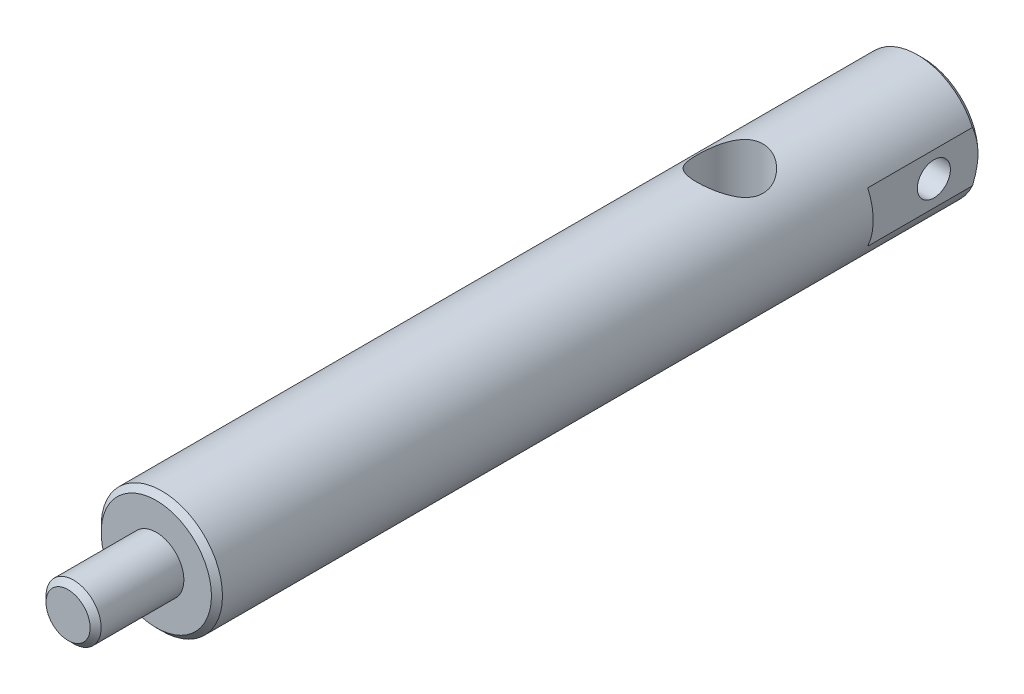
ISO-10303-21;
HEADER;
FILE_DESCRIPTION(('STEP AP214'),'2;1');
FILE_NAME('part.step','',(''),(''),'','','');
FILE_SCHEMA(('AUTOMOTIVE_DESIGN { 1 0 10303 214 1 1 1 1 }'));
ENDSEC;
DATA;
#1=APPLICATION_CONTEXT('core data for automotive mechanical design processes');
#2=APPLICATION_PROTOCOL_DEFINITION('international standard','automotive_design',2000,#1);
#3=PRODUCT_CONTEXT('',#1,'mechanical');
#4=PRODUCT('Part','Part','',(#3));
#5=PRODUCT_RELATED_PRODUCT_CATEGORY('part','',(#4));
#6=PRODUCT_DEFINITION_FORMATION('','',#4);
#7=PRODUCT_DEFINITION_CONTEXT('part definition',#1,'design');
#8=PRODUCT_DEFINITION('design','',#6,#7);
#9=PRODUCT_DEFINITION_SHAPE('','',#8);
#10=(LENGTH_UNIT() NAMED_UNIT(*) SI_UNIT(.MILLI.,.METRE.));
#11=(NAMED_UNIT(*) PLANE_ANGLE_UNIT() SI_UNIT($,.RADIAN.));
#12=(NAMED_UNIT(*) SI_UNIT($,.STERADIAN.) SOLID_ANGLE_UNIT());
#13=UNCERTAINTY_MEASURE_WITH_UNIT(LENGTH_MEASURE(1.E-05),#10,'distance_accuracy_value','');
#14=(GEOMETRIC_REPRESENTATION_CONTEXT(3) GLOBAL_UNCERTAINTY_ASSIGNED_CONTEXT((#13)) GLOBAL_UNIT_ASSIGNED_CONTEXT((#10,
#11,#12)) REPRESENTATION_CONTEXT('',''));
#15=CARTESIAN_POINT('',(0.,0.,0.));
#16=DIRECTION('',(0.,0.,1.));
#17=DIRECTION('',(1.,0.,0.));
#18=AXIS2_PLACEMENT_3D('',#15,#16,#17);
#19=CARTESIAN_POINT('',(0.,0.,0.500000000000014));
#20=DIRECTION('',(0.,0.,1.));
#21=DIRECTION('',(1.,0.,0.));
#22=AXIS2_PLACEMENT_3D('',#19,#20,#21);
#23=CONICAL_SURFACE('',#22,5.5,0.785398163397443);
#24=CARTESIAN_POINT('',(-5.,-3.59605027477681,1.15886171128421));
#25=CARTESIAN_POINT('',(-5.,-3.5057054306609,1.10611666521081));
#26=CARTESIAN_POINT('',(-5.,-3.41479612769908,1.05434027979705));
#27=CARTESIAN_POINT('',(-5.,-3.23172350305265,0.953000108204818));
#28=CARTESIAN_POINT('',(-5.,-3.13955986612799,0.903436892158479));
#29=CARTESIAN_POINT('',(-5.,-2.86034805305465,0.758144595115378));
#30=CARTESIAN_POINT('',(-5.,-2.67127970378338,0.66622747635825));
#31=CARTESIAN_POINT('',(-5.,-2.28407584772363,0.494217891562359));
#32=CARTESIAN_POINT('',(-5.,-2.08584276940193,0.414342642103693));
#33=CARTESIAN_POINT('',(-5.,-1.68330442783959,0.272400086167916));
#34=CARTESIAN_POINT('',(-5.,-1.47901002692424,0.210302823558386));
#35=CARTESIAN_POINT('',(-5.,-1.14754801322566,0.128576798986462));
#36=CARTESIAN_POINT('',(-5.,-1.02210995808063,0.101887344642865));
#37=CARTESIAN_POINT('',(-5.,-0.769641255775877,0.0573632386148024));
#38=CARTESIAN_POINT('',(-5.,-0.642610531730337,0.0395290161157409));
#39=CARTESIAN_POINT('',(-5.,-0.388638018822018,0.0135039770324979));
#40=CARTESIAN_POINT('',(-5.,-0.261704508346706,0.00523313080455806));
#41=CARTESIAN_POINT('',(-5.,-0.0075734961203176,-0.00160825561372747));
#42=CARTESIAN_POINT('',(-5.,0.119624011549556,-0.000178575918303746));
#43=CARTESIAN_POINT('',(-5.,0.393277408420786,0.0133041793929394));
#44=CARTESIAN_POINT('',(-5.,0.539655207095598,0.0269731682855102));
#45=CARTESIAN_POINT('',(-5.,0.830756491663134,0.0664914605878033));
#46=CARTESIAN_POINT('',(-5.,0.975479638048458,0.092343219339984));
#47=CARTESIAN_POINT('',(-5.,1.26429120607209,0.155416051958378));
#48=CARTESIAN_POINT('',(-5.,1.40834917898135,0.192774954808121));
#49=CARTESIAN_POINT('',(-5.,1.69350482897433,0.27725361613581));
#50=CARTESIAN_POINT('',(-5.,1.83460309803712,0.324371401809384));
#51=CARTESIAN_POINT('',(-5.,2.15286476123639,0.441248293288971));
#52=CARTESIAN_POINT('',(-5.,2.32905225093761,0.51365188230633));
#53=CARTESIAN_POINT('',(-5.,2.67664432359225,0.669236750507722));
#54=CARTESIAN_POINT('',(-5.,2.84804630257685,0.752423763590871));
#55=CARTESIAN_POINT('',(-5.,3.18703727799204,0.927569112430905));
#56=CARTESIAN_POINT('',(-5.,3.35461076438016,1.01955723478527));
#57=CARTESIAN_POINT('',(-5.,3.68583270101324,1.21023606625668));
#58=CARTESIAN_POINT('',(-5.,3.84948185902625,1.30892555426514));
#59=CARTESIAN_POINT('',(-5.,4.1658857680653,1.50692724123942));
#60=CARTESIAN_POINT('',(-5.,4.31879313955326,1.60599682317832));
#61=CARTESIAN_POINT('',(-5.,4.62198652599246,1.8080831313131));
#62=CARTESIAN_POINT('',(-5.,4.77227232695427,1.91110017755267));
#63=CARTESIAN_POINT('',(-5.,5.06930043880817,2.11945768935238));
#64=CARTESIAN_POINT('',(-5.,5.2160620729335,2.22477070562688));
#65=CARTESIAN_POINT('',(-5.,5.50761291243092,2.43801228770006));
#66=CARTESIAN_POINT('',(-5.,5.65240264981636,2.54594012527707));
#67=CARTESIAN_POINT('',(-5.,5.79637433820874,2.65493014133019));
#68=B_SPLINE_CURVE_WITH_KNOTS('',3,(#24,#25,#26,#27,#28,#29,#30,#31,#32,#33,#34,#35,#36,#37,#38,
#39,#40,#41,#42,#43,#44,#45,#46,#47,#48,#49,#50,#51,#52,#53,#54,#55,#56,#57,#58,#59,#60,#61,#62,
#63,#64,#65,#66,#67),.UNSPECIFIED.,.F.,.F.,(4,2,2,2,2,2,2,2,2,2,2,2,2,2,2,2,2,2,2,2,2,4),(0.,
0.313832173275975,0.627744731530514,1.25800962201332,1.89855009594016,2.53800481166332,
2.92247147827315,3.30695677696199,3.68820073621962,4.06945333731811,4.50993622933902,
4.9505079352507,5.39657659374408,5.8425551652068,6.41353259125284,6.98481487969802,
7.55810405253176,8.13128904071377,8.6778051629313,9.22436568850415,9.7662459996794,
10.3079770948805),.UNSPECIFIED.);
#69=CARTESIAN_POINT('',(-5.,2.29128784747841,0.499999999999884));
#70=VERTEX_POINT('',#69);
#71=CARTESIAN_POINT('',(-5.,0.,0.));
#72=VERTEX_POINT('',#71);
#73=EDGE_CURVE('E51',#70,#72,#68,.F.);
#74=ORIENTED_EDGE('',*,*,#73,.F.);
#75=CARTESIAN_POINT('',(0.,0.,0.500000000000014));
#76=DIRECTION('',(0.,0.,1.));
#77=DIRECTION('',(1.,0.,0.));
#78=AXIS2_PLACEMENT_3D('',#75,#76,#77);
#79=CIRCLE('',#78,5.5);
#80=CARTESIAN_POINT('',(5.,2.29128784747841,0.499999999999884));
#81=VERTEX_POINT('',#80);
#82=EDGE_CURVE('E97',#81,#70,#79,.T.);
#83=ORIENTED_EDGE('',*,*,#82,.F.);
#84=CARTESIAN_POINT('',(5.,-3.59605027477681,1.15886171128421));
#85=CARTESIAN_POINT('',(5.,-3.5057054306609,1.10611666521081));
#86=CARTESIAN_POINT('',(5.,-3.41479612769908,1.05434027979705));
#87=CARTESIAN_POINT('',(5.,-3.23172350305265,0.953000108204818));
#88=CARTESIAN_POINT('',(5.,-3.13955986612799,0.903436892158479));
#89=CARTESIAN_POINT('',(5.,-2.86034805305465,0.758144595115378));
#90=CARTESIAN_POINT('',(5.,-2.67127970378338,0.66622747635825));
#91=CARTESIAN_POINT('',(5.,-2.28407584772363,0.494217891562359));
#92=CARTESIAN_POINT('',(5.,-2.08584276940193,0.414342642103693));
#93=CARTESIAN_POINT('',(5.,-1.68330442783959,0.272400086167916));
#94=CARTESIAN_POINT('',(5.,-1.47901002692424,0.210302823558386));
#95=CARTESIAN_POINT('',(5.,-1.14754801322566,0.128576798986462));
#96=CARTESIAN_POINT('',(5.,-1.02210995808063,0.101887344642865));
#97=CARTESIAN_POINT('',(5.,-0.769641255775877,0.0573632386148024));
#98=CARTESIAN_POINT('',(5.,-0.642610531730337,0.0395290161157409));
#99=CARTESIAN_POINT('',(5.,-0.388638018822018,0.0135039770324979));
#100=CARTESIAN_POINT('',(5.,-0.261704508346706,0.00523313080455806));
#101=CARTESIAN_POINT('',(5.,-0.0075734961203176,-0.00160825561372747));
#102=CARTESIAN_POINT('',(5.,0.119624011549556,-0.000178575918303746));
#103=CARTESIAN_POINT('',(5.,0.393277408420786,0.0133041793929394));
#104=CARTESIAN_POINT('',(5.,0.539655207095598,0.0269731682855102));
#105=CARTESIAN_POINT('',(5.,0.830756491663134,0.0664914605878033));
#106=CARTESIAN_POINT('',(5.,0.975479638048458,0.092343219339984));
#107=CARTESIAN_POINT('',(5.,1.26429120607209,0.155416051958378));
#108=CARTESIAN_POINT('',(5.,1.40834917898135,0.192774954808121));
#109=CARTESIAN_POINT('',(5.,1.69350482897433,0.27725361613581));
#110=CARTESIAN_POINT('',(5.,1.83460309803712,0.324371401809384));
#111=CARTESIAN_POINT('',(5.,2.15286476123639,0.441248293288971));
#112=CARTESIAN_POINT('',(5.,2.32905225093761,0.51365188230633));
#113=CARTESIAN_POINT('',(5.,2.67664432359225,0.669236750507722));
#114=CARTESIAN_POINT('',(5.,2.84804630257685,0.752423763590871));
#115=CARTESIAN_POINT('',(5.,3.18703727799204,0.927569112430905));
#116=CARTESIAN_POINT('',(5.,3.35461076438016,1.01955723478527));
#117=CARTESIAN_POINT('',(5.,3.68583270101324,1.21023606625668));
#118=CARTESIAN_POINT('',(5.,3.84948185902625,1.30892555426514));
#119=CARTESIAN_POINT('',(5.,4.1658857680653,1.50692724123942));
#120=CARTESIAN_POINT('',(5.,4.31879313955326,1.60599682317832));
#121=CARTESIAN_POINT('',(5.,4.62198652599246,1.8080831313131));
#122=CARTESIAN_POINT('',(5.,4.77227232695427,1.91110017755267));
#123=CARTESIAN_POINT('',(5.,5.06930043880817,2.11945768935238));
#124=CARTESIAN_POINT('',(5.,5.2160620729335,2.22477070562688));
#125=CARTESIAN_POINT('',(5.,5.50761291243092,2.43801228770006));
#126=CARTESIAN_POINT('',(5.,5.65240264981636,2.54594012527707));
#127=CARTESIAN_POINT('',(5.,5.79637433820874,2.65493014133019));
#128=B_SPLINE_CURVE_WITH_KNOTS('',3,(#84,#85,#86,#87,#88,#89,#90,#91,#92,#93,#94,#95,#96,#97,
#98,#99,#100,#101,#102,#103,#104,#105,#106,#107,#108,#109,#110,#111,#112,#113,#114,#115,#116,
#117,#118,#119,#120,#121,#122,#123,#124,#125,#126,#127),.UNSPECIFIED.,.F.,.F.,(4,2,2,2,2,2,2,2,
2,2,2,2,2,2,2,2,2,2,2,2,2,4),(0.,0.313832173275975,0.627744731530514,1.25800962201332,
1.89855009594016,2.53800481166332,2.92247147827315,3.30695677696199,3.68820073621962,
4.06945333731811,4.50993622933902,4.9505079352507,5.39657659374408,5.8425551652068,
6.41353259125284,6.98481487969802,7.55810405253176,8.13128904071377,8.6778051629313,
9.22436568850415,9.7662459996794,10.3079770948805),.UNSPECIFIED.);
#129=CARTESIAN_POINT('',(5.,0.,0.));
#130=VERTEX_POINT('',#129);
#131=EDGE_CURVE('E122',#81,#130,#128,.F.);
#132=ORIENTED_EDGE('',*,*,#131,.T.);
#133=CARTESIAN_POINT('',(0.,0.,0.));
#134=DIRECTION('',(0.,0.,1.));
#135=DIRECTION('',(1.,0.,0.));
#136=AXIS2_PLACEMENT_3D('',#133,#134,#135);
#137=CIRCLE('',#136,4.99999999999999);
#138=EDGE_CURVE('E162',#72,#130,#137,.F.);
#139=ORIENTED_EDGE('',*,*,#138,.F.);
#140=EDGE_LOOP('',(#74,#83,#132,#139));
#141=FACE_BOUND('',#140,.T.);
#142=ADVANCED_FACE('F36',(#141),#23,.T.);
#143=CARTESIAN_POINT('',(0.,0.,69.5));
#144=DIRECTION('',(0.,0.,-1.));
#145=DIRECTION('',(-1.,0.,0.));
#146=AXIS2_PLACEMENT_3D('',#143,#144,#145);
#147=CYLINDRICAL_SURFACE('',#146,5.5);
#148=CARTESIAN_POINT('',(0.,0.,69.));
#149=DIRECTION('',(0.,0.,1.));
#150=DIRECTION('',(1.,0.,0.));
#151=AXIS2_PLACEMENT_3D('',#148,#149,#150);
#152=CIRCLE('',#151,5.5);
#153=CARTESIAN_POINT('',(5.5,0.,69.));
#154=VERTEX_POINT('',#153);
#155=EDGE_CURVE('E215',#154,#154,#152,.F.);
#156=ORIENTED_EDGE('',*,*,#155,.T.);
#157=EDGE_LOOP('',(#156));
#158=FACE_BOUND('',#157,.T.);
#159=CARTESIAN_POINT('',(0.,5.5,20.5));
#160=CARTESIAN_POINT('',(-0.155941063421442,5.49998934645942,20.4999877662548));
#161=CARTESIAN_POINT('',(-0.312022244637955,5.49329922861326,20.4877694125018));
#162=CARTESIAN_POINT('',(-0.619456123460682,5.46719110321039,20.4394852853526));
#163=CARTESIAN_POINT('',(-0.770801809879889,5.44775507973285,20.4033857560615));
#164=CARTESIAN_POINT('',(-1.06387890229515,5.39816336864634,20.3092272238748));
#165=CARTESIAN_POINT('',(-1.2056469629153,5.36805167294482,20.2512582777309));
#166=CARTESIAN_POINT('',(-1.47716738440041,5.29977412152277,20.115538455863));
#167=CARTESIAN_POINT('',(-1.60691935336558,5.26160800324365,20.0377869352483));
#168=CARTESIAN_POINT('',(-1.86065808630956,5.17754827162183,19.8587435424476));
#169=CARTESIAN_POINT('',(-1.98365138350542,5.13130551076905,19.7562096415092));
#170=CARTESIAN_POINT('',(-2.21162440384053,5.03725688162035,19.533272980365));
#171=CARTESIAN_POINT('',(-2.3165875795777,4.98944962487666,19.4128539928279));
#172=CARTESIAN_POINT('',(-2.51580320599146,4.89225579731101,19.1435803135383));
#173=CARTESIAN_POINT('',(-2.60804479874463,4.84316197373407,18.9931029766299));
#174=CARTESIAN_POINT('',(-2.72612131067995,4.77706066879849,18.7554329512829));
#175=CARTESIAN_POINT('',(-2.76210762605457,4.75627790322473,18.6741887112285));
#176=CARTESIAN_POINT('',(-2.82693033455558,4.71803762242415,18.508162014977));
#177=CARTESIAN_POINT('',(-2.85577130922819,4.70057797810682,18.423381866943));
#178=CARTESIAN_POINT('',(-2.90433120982499,4.67071979929958,18.2562758650531));
#179=CARTESIAN_POINT('',(-2.92450709956388,4.65807341027243,18.174127047143));
#180=CARTESIAN_POINT('',(-2.95790013004684,4.636940586029,18.0079411359504));
#181=CARTESIAN_POINT('',(-2.971121334648,4.62845172163124,17.9239051753919));
#182=CARTESIAN_POINT('',(-2.99037426310065,4.61603691921718,17.7547480886835));
#183=CARTESIAN_POINT('',(-2.99641259468195,4.61210678757553,17.6696280328096));
#184=CARTESIAN_POINT('',(-3.00121376340649,4.60898198112864,17.4991264208564));
#185=CARTESIAN_POINT('',(-2.99997756333253,4.60978667966958,17.4137449008767));
#186=CARTESIAN_POINT('',(-2.98681097313761,4.61834579083673,17.1839186459394));
#187=CARTESIAN_POINT('',(-2.96800123578851,4.63057015028549,17.039960886788));
#188=CARTESIAN_POINT('',(-2.91031570386976,4.66703114872268,16.7577953718672));
#189=CARTESIAN_POINT('',(-2.87143107833692,4.69127307406343,16.6195901755933));
#190=CARTESIAN_POINT('',(-2.7741819673555,4.74943950696628,16.3488923988327));
#191=CARTESIAN_POINT('',(-2.71541055604208,4.78356393514266,16.2165905256558));
#192=CARTESIAN_POINT('',(-2.58039836306706,4.85772269523237,15.9630534831025));
#193=CARTESIAN_POINT('',(-2.50414997528337,4.89775959759585,15.8418231643756));
#194=CARTESIAN_POINT('',(-2.32264342212813,4.9866863072689,15.5941131405792));
#195=CARTESIAN_POINT('',(-2.21472183175866,5.03598723363806,15.4697250091241));
#196=CARTESIAN_POINT('',(-1.979587611086,5.13297379201875,15.2398474693487));
#197=CARTESIAN_POINT('',(-1.85236228439249,5.18065833546759,15.1343705996332));
#198=CARTESIAN_POINT('',(-1.57192373832685,5.27277876450855,14.9387259808247));
#199=CARTESIAN_POINT('',(-1.41755927747899,5.31680246425557,14.849997600042));
#200=CARTESIAN_POINT('',(-1.09311155895661,5.39284422102395,14.700549942222));
#201=CARTESIAN_POINT('',(-0.923043054476389,5.42487340611344,14.6398046913659));
#202=CARTESIAN_POINT('',(-0.588793718376776,5.47075015884767,14.5537655013334));
#203=CARTESIAN_POINT('',(-0.42551758122758,5.48600266963768,14.5257176122815));
#204=CARTESIAN_POINT('',(-0.0959037074405219,5.50163219493907,14.4969820024157));
#205=CARTESIAN_POINT('',(0.0704320609196717,5.5020184597207,14.496277267784));
#206=CARTESIAN_POINT('',(0.384407887416388,5.48858467704625,14.5209672515069));
#207=CARTESIAN_POINT('',(0.53231256443774,5.47612189948116,14.5438683853257));
#208=CARTESIAN_POINT('',(0.821803448329099,5.44021310025175,14.6109310342557));
#209=CARTESIAN_POINT('',(0.963389009570952,5.4167659591087,14.6550947163665));
#210=CARTESIAN_POINT('',(1.24014411300805,5.36026763933604,14.7641836379088));
#211=CARTESIAN_POINT('',(1.37508882708081,5.32700641844797,14.829566442533));
#212=CARTESIAN_POINT('',(1.63245398018259,5.25385773737809,14.9786432802591));
#213=CARTESIAN_POINT('',(1.75486972773108,5.21396780963469,15.0623441360179));
#214=CARTESIAN_POINT('',(1.99815282198784,5.12600339488922,15.2563006073752));
#215=CARTESIAN_POINT('',(2.11734529259495,5.07751178350356,15.3684710532815));
#216=CARTESIAN_POINT('',(2.33610542561796,4.98065786860873,15.6107358887599));
#217=CARTESIAN_POINT('',(2.43565323999882,4.93229574408554,15.7408481828016));
#218=CARTESIAN_POINT('',(2.61963250753659,4.83725612466919,16.0273993369393));
#219=CARTESIAN_POINT('',(2.70237599151256,4.79097531469677,16.1850795072938));
#220=CARTESIAN_POINT('',(2.80508264493023,4.73107633674494,16.4325213009553));
#221=CARTESIAN_POINT('',(2.83575119684129,4.71269630244517,16.5168270847385));
#222=CARTESIAN_POINT('',(2.88956639673594,4.67989324762477,16.688531314357));
#223=CARTESIAN_POINT('',(2.91271827500878,4.66546747672198,16.7759275626111));
#224=CARTESIAN_POINT('',(2.94925497294053,4.64244713409255,16.9444842668566));
#225=CARTESIAN_POINT('',(2.96336861092828,4.63342309946558,17.0254288052285));
#226=CARTESIAN_POINT('',(2.98491873324379,4.61956980430958,17.1885192401405));
#227=CARTESIAN_POINT('',(2.99235896403634,4.61473819019659,17.2706644362694));
#228=CARTESIAN_POINT('',(3.00043681599168,4.60949070639388,17.4353989326076));
#229=CARTESIAN_POINT('',(3.00107744502081,4.60907288422311,17.5179880202797));
#230=CARTESIAN_POINT('',(2.99556143120456,4.61265809188789,17.6828158305591));
#231=CARTESIAN_POINT('',(2.98940531592176,4.61666077860402,17.7650545798623));
#232=CARTESIAN_POINT('',(2.9633926459875,4.63343681741844,17.988469869328));
#233=CARTESIAN_POINT('',(2.93679716733749,4.65049102224355,18.1286074726012));
#234=CARTESIAN_POINT('',(2.86467928059993,4.69524977180096,18.4020365335802));
#235=CARTESIAN_POINT('',(2.81914932754626,4.72295856181586,18.5353252383374));
#236=CARTESIAN_POINT('',(2.70741690494187,4.78793410722282,18.8007271622297));
#237=CARTESIAN_POINT('',(2.64010400762599,4.82568847064193,18.9322507112133));
#238=CARTESIAN_POINT('',(2.48777352181176,4.90595435235985,19.1830136547513));
#239=CARTESIAN_POINT('',(2.40274647839871,4.94846840551116,19.3022464381075));
#240=CARTESIAN_POINT('',(2.20222061562177,5.04125256725258,19.544152079525));
#241=CARTESIAN_POINT('',(2.08404782523582,5.09171152558289,19.6645437340499));
#242=CARTESIAN_POINT('',(1.82816340070134,5.18907654030365,19.8845884103391));
#243=CARTESIAN_POINT('',(1.69043824590899,5.23598010338573,19.9842269625138));
#244=CARTESIAN_POINT('',(1.46905733234175,5.30076189758551,20.1171783146547));
#245=CARTESIAN_POINT('',(1.39145055424038,5.3217101130451,20.1592687034044));
#246=CARTESIAN_POINT('',(1.23226646886365,5.36080405718826,20.2366657840448));
#247=CARTESIAN_POINT('',(1.15069113181445,5.37895115820844,20.2719757998936));
#248=CARTESIAN_POINT('',(0.98429370795354,5.41187085663624,20.3353265604725));
#249=CARTESIAN_POINT('',(0.899478289502253,5.42664999034571,20.3633814000333));
#250=CARTESIAN_POINT('',(0.727186421620298,5.45241071911953,20.4119075035694));
#251=CARTESIAN_POINT('',(0.639711415020916,5.46339433463232,20.4323828027367));
#252=CARTESIAN_POINT('',(0.460742252695544,5.4814220540886,20.4658377780891));
#253=CARTESIAN_POINT('',(0.369201999270188,5.48836591659683,20.4786269678444));
#254=CARTESIAN_POINT('',(0.185124291419893,5.49765803948959,20.4957116870508));
#255=CARTESIAN_POINT('',(0.0925868425200918,5.50000632532357,20.500007263538));
#256=CARTESIAN_POINT('',(0.,5.5,20.5));
#257=B_SPLINE_CURVE_WITH_KNOTS('',3,(#159,#160,#161,#162,#163,#164,#165,#166,#167,#168,#169,
#170,#171,#172,#173,#174,#175,#176,#177,#178,#179,#180,#181,#182,#183,#184,#185,#186,#187,#188,
#189,#190,#191,#192,#193,#194,#195,#196,#197,#198,#199,#200,#201,#202,#203,#204,#205,#206,#207,
#208,#209,#210,#211,#212,#213,#214,#215,#216,#217,#218,#219,#220,#221,#222,#223,#224,#225,#226,
#227,#228,#229,#230,#231,#232,#233,#234,#235,#236,#237,#238,#239,#240,#241,#242,#243,#244,#245,
#246,#247,#248,#249,#250,#251,#252,#253,#254,#255,#256),.UNSPECIFIED.,.T.,.F.,(4,2,2,2,2,2,2,2,
2,2,2,2,2,2,2,2,2,2,2,2,2,2,2,2,2,2,2,2,2,2,2,2,2,2,2,2,2,2,2,2,2,2,2,2,2,2,2,2,4),(0.,
0.467464731341324,0.935591637089735,1.40181150541894,1.86804657396241,2.36601468756277,
2.86443740470113,3.41095517185004,3.68439317893577,3.95765540292371,4.21386369857626,
4.46992211630614,4.72574479597636,4.9815336183278,5.41635042414011,5.85135866948457,
6.29586830542887,6.74057176413252,7.25410335547648,7.76797418110978,8.31522244881978,
8.86196173449554,9.35825276824622,9.85423498829535,10.3027073697705,10.7512254675536,
11.2101412211659,11.6692281922007,12.1791893511332,12.6896631420853,13.2383253286891,
13.5126865564027,13.7868564655196,14.0344708636163,14.2819461633036,14.5293119854526,
14.7766586084424,15.2055282482925,15.6345689471345,16.0903172872744,16.5463095089045,
17.0722946439693,17.5986452905915,17.8705372435758,18.1422955641225,18.4135218974199,
18.6846036269962,18.9621528638644,19.2397005637119),.UNSPECIFIED.);
#258=CARTESIAN_POINT('',(0.,5.5,20.5));
#259=VERTEX_POINT('',#258);
#260=EDGE_CURVE('E180',#259,#259,#257,.T.);
#261=ORIENTED_EDGE('',*,*,#260,.T.);
#262=EDGE_LOOP('',(#261));
#263=FACE_BOUND('',#262,.T.);
#264=CARTESIAN_POINT('',(0.,-5.5,20.5));
#265=CARTESIAN_POINT('',(0.155941063421446,-5.49998934645942,20.4999877662548));
#266=CARTESIAN_POINT('',(0.312022244637959,-5.49329922861326,20.4877694125018));
#267=CARTESIAN_POINT('',(0.619456123460687,-5.46719110321039,20.4394852853526));
#268=CARTESIAN_POINT('',(0.770801809879893,-5.44775507973285,20.4033857560615));
#269=CARTESIAN_POINT('',(1.06387890229515,-5.39816336864634,20.3092272238748));
#270=CARTESIAN_POINT('',(1.2056469629153,-5.36805167294482,20.2512582777309));
#271=CARTESIAN_POINT('',(1.47716738440041,-5.29977412152277,20.115538455863));
#272=CARTESIAN_POINT('',(1.60691935336558,-5.26160800324364,20.0377869352483));
#273=CARTESIAN_POINT('',(1.86065808630957,-5.17754827162183,19.8587435424476));
#274=CARTESIAN_POINT('',(1.98365138350542,-5.13130551076905,19.7562096415092));
#275=CARTESIAN_POINT('',(2.21162440384053,-5.03725688162035,19.533272980365));
#276=CARTESIAN_POINT('',(2.3165875795777,-4.98944962487665,19.4128539928279));
#277=CARTESIAN_POINT('',(2.51580320599147,-4.89225579731101,19.1435803135383));
#278=CARTESIAN_POINT('',(2.60804479874463,-4.84316197373407,18.9931029766299));
#279=CARTESIAN_POINT('',(2.72612131067995,-4.77706066879849,18.7554329512829));
#280=CARTESIAN_POINT('',(2.76210762605458,-4.75627790322473,18.6741887112285));
#281=CARTESIAN_POINT('',(2.82693033455558,-4.71803762242414,18.508162014977));
#282=CARTESIAN_POINT('',(2.8557713092282,-4.70057797810682,18.423381866943));
#283=CARTESIAN_POINT('',(2.90433120982499,-4.67071979929958,18.2562758650532));
#284=CARTESIAN_POINT('',(2.92450709956388,-4.65807341027243,18.1741270471431));
#285=CARTESIAN_POINT('',(2.95790013004685,-4.636940586029,18.0079411359504));
#286=CARTESIAN_POINT('',(2.97112133464801,-4.62845172163124,17.9239051753919));
#287=CARTESIAN_POINT('',(2.99037426310065,-4.61603691921717,17.7547480886835));
#288=CARTESIAN_POINT('',(2.99641259468195,-4.61210678757552,17.6696280328096));
#289=CARTESIAN_POINT('',(3.00121376340649,-4.60898198112864,17.4991264208564));
#290=CARTESIAN_POINT('',(2.99997756333254,-4.60978667966957,17.4137449008767));
#291=CARTESIAN_POINT('',(2.98681097313761,-4.61834579083673,17.1839186459394));
#292=CARTESIAN_POINT('',(2.96800123578851,-4.63057015028549,17.039960886788));
#293=CARTESIAN_POINT('',(2.91031570386976,-4.66703114872268,16.7577953718672));
#294=CARTESIAN_POINT('',(2.87143107833693,-4.69127307406343,16.6195901755933));
#295=CARTESIAN_POINT('',(2.77418196735551,-4.74943950696628,16.3488923988327));
#296=CARTESIAN_POINT('',(2.71541055604209,-4.78356393514266,16.2165905256558));
#297=CARTESIAN_POINT('',(2.58039836306707,-4.85772269523237,15.9630534831025));
#298=CARTESIAN_POINT('',(2.50414997528338,-4.89775959759585,15.8418231643756));
#299=CARTESIAN_POINT('',(2.32264342212813,-4.98668630726889,15.5941131405792));
#300=CARTESIAN_POINT('',(2.21472183175867,-5.03598723363806,15.4697250091241));
#301=CARTESIAN_POINT('',(1.97958761108601,-5.13297379201875,15.2398474693487));
#302=CARTESIAN_POINT('',(1.8523622843925,-5.18065833546759,15.1343705996332));
#303=CARTESIAN_POINT('',(1.57192373832685,-5.27277876450854,14.9387259808247));
#304=CARTESIAN_POINT('',(1.41755927747899,-5.31680246425557,14.849997600042));
#305=CARTESIAN_POINT('',(1.09311155895662,-5.39284422102395,14.700549942222));
#306=CARTESIAN_POINT('',(0.923043054476394,-5.42487340611344,14.6398046913659));
#307=CARTESIAN_POINT('',(0.588793718376781,-5.47075015884767,14.5537655013334));
#308=CARTESIAN_POINT('',(0.425517581227584,-5.48600266963768,14.5257176122815));
#309=CARTESIAN_POINT('',(0.095903707440526,-5.50163219493907,14.4969820024157));
#310=CARTESIAN_POINT('',(-0.0704320609196674,-5.5020184597207,14.496277267784));
#311=CARTESIAN_POINT('',(-0.384407887416383,-5.48858467704625,14.5209672515069));
#312=CARTESIAN_POINT('',(-0.532312564437735,-5.47612189948116,14.5438683853257));
#313=CARTESIAN_POINT('',(-0.821803448329094,-5.44021310025175,14.6109310342557));
#314=CARTESIAN_POINT('',(-0.963389009570948,-5.4167659591087,14.6550947163665));
#315=CARTESIAN_POINT('',(-1.24014411300804,-5.36026763933604,14.7641836379088));
#316=CARTESIAN_POINT('',(-1.3750888270808,-5.32700641844797,14.829566442533));
#317=CARTESIAN_POINT('',(-1.63245398018258,-5.25385773737809,14.9786432802591));
#318=CARTESIAN_POINT('',(-1.75486972773107,-5.21396780963469,15.0623441360179));
#319=CARTESIAN_POINT('',(-1.99815282198783,-5.12600339488922,15.2563006073752));
#320=CARTESIAN_POINT('',(-2.11734529259495,-5.07751178350357,15.3684710532815));
#321=CARTESIAN_POINT('',(-2.33610542561795,-4.98065786860873,15.6107358887599));
#322=CARTESIAN_POINT('',(-2.43565323999881,-4.93229574408554,15.7408481828016));
#323=CARTESIAN_POINT('',(-2.61963250753658,-4.83725612466919,16.0273993369393));
#324=CARTESIAN_POINT('',(-2.70237599151256,-4.79097531469677,16.1850795072938));
#325=CARTESIAN_POINT('',(-2.80508264493022,-4.73107633674494,16.4325213009553));
#326=CARTESIAN_POINT('',(-2.83575119684129,-4.71269630244518,16.5168270847385));
#327=CARTESIAN_POINT('',(-2.88956639673594,-4.67989324762477,16.688531314357));
#328=CARTESIAN_POINT('',(-2.91271827500878,-4.66546747672198,16.7759275626111));
#329=CARTESIAN_POINT('',(-2.94925497294053,-4.64244713409255,16.9444842668566));
#330=CARTESIAN_POINT('',(-2.96336861092828,-4.63342309946558,17.0254288052285));
#331=CARTESIAN_POINT('',(-2.98491873324378,-4.61956980430958,17.1885192401405));
#332=CARTESIAN_POINT('',(-2.99235896403633,-4.61473819019659,17.2706644362694));
#333=CARTESIAN_POINT('',(-3.00043681599167,-4.60949070639388,17.4353989326076));
#334=CARTESIAN_POINT('',(-3.00107744502081,-4.60907288422311,17.5179880202797));
#335=CARTESIAN_POINT('',(-2.99556143120456,-4.6126580918879,17.6828158305591));
#336=CARTESIAN_POINT('',(-2.98940531592175,-4.61666077860402,17.7650545798623));
#337=CARTESIAN_POINT('',(-2.96339264598749,-4.63343681741845,17.988469869328));
#338=CARTESIAN_POINT('',(-2.93679716733749,-4.65049102224356,18.1286074726012));
#339=CARTESIAN_POINT('',(-2.86467928059993,-4.69524977180096,18.4020365335802));
#340=CARTESIAN_POINT('',(-2.81914932754625,-4.72295856181586,18.5353252383374));
#341=CARTESIAN_POINT('',(-2.70741690494186,-4.78793410722282,18.8007271622297));
#342=CARTESIAN_POINT('',(-2.64010400762598,-4.82568847064194,18.9322507112133));
#343=CARTESIAN_POINT('',(-2.48777352181176,-4.90595435235985,19.1830136547513));
#344=CARTESIAN_POINT('',(-2.4027464783987,-4.94846840551116,19.3022464381075));
#345=CARTESIAN_POINT('',(-2.20222061562176,-5.04125256725259,19.544152079525));
#346=CARTESIAN_POINT('',(-2.08404782523581,-5.09171152558289,19.6645437340499));
#347=CARTESIAN_POINT('',(-1.82816340070133,-5.18907654030366,19.8845884103391));
#348=CARTESIAN_POINT('',(-1.69043824590899,-5.23598010338573,19.9842269625138));
#349=CARTESIAN_POINT('',(-1.46905733234175,-5.30076189758551,20.1171783146547));
#350=CARTESIAN_POINT('',(-1.39145055424038,-5.3217101130451,20.1592687034044));
#351=CARTESIAN_POINT('',(-1.23226646886365,-5.36080405718826,20.2366657840448));
#352=CARTESIAN_POINT('',(-1.15069113181444,-5.37895115820844,20.2719757998936));
#353=CARTESIAN_POINT('',(-0.984293707953535,-5.41187085663624,20.3353265604725));
#354=CARTESIAN_POINT('',(-0.899478289502249,-5.42664999034571,20.3633814000333));
#355=CARTESIAN_POINT('',(-0.727186421620293,-5.45241071911953,20.4119075035694));
#356=CARTESIAN_POINT('',(-0.639711415020911,-5.46339433463232,20.4323828027367));
#357=CARTESIAN_POINT('',(-0.460742252695539,-5.4814220540886,20.4658377780891));
#358=CARTESIAN_POINT('',(-0.369201999270183,-5.48836591659683,20.4786269678444));
#359=CARTESIAN_POINT('',(-0.185124291419889,-5.49765803948959,20.4957116870508));
#360=CARTESIAN_POINT('',(-0.0925868425200875,-5.50000632532357,20.500007263538));
#361=CARTESIAN_POINT('',(0.,-5.5,20.5));
#362=B_SPLINE_CURVE_WITH_KNOTS('',3,(#264,#265,#266,#267,#268,#269,#270,#271,#272,#273,#274,
#275,#276,#277,#278,#279,#280,#281,#282,#283,#284,#285,#286,#287,#288,#289,#290,#291,#292,#293,
#294,#295,#296,#297,#298,#299,#300,#301,#302,#303,#304,#305,#306,#307,#308,#309,#310,#311,#312,
#313,#314,#315,#316,#317,#318,#319,#320,#321,#322,#323,#324,#325,#326,#327,#328,#329,#330,#331,
#332,#333,#334,#335,#336,#337,#338,#339,#340,#341,#342,#343,#344,#345,#346,#347,#348,#349,#350,
#351,#352,#353,#354,#355,#356,#357,#358,#359,#360,#361),.UNSPECIFIED.,.T.,.F.,(4,2,2,2,2,2,2,2,
2,2,2,2,2,2,2,2,2,2,2,2,2,2,2,2,2,2,2,2,2,2,2,2,2,2,2,2,2,2,2,2,2,2,2,2,2,2,2,2,4),(0.,
0.467464731341324,0.935591637089735,1.40181150541894,1.86804657396241,2.36601468756277,
2.86443740470113,3.41095517185004,3.68439317893576,3.95765540292371,4.21386369857625,
4.46992211630614,4.72574479597636,4.9815336183278,5.41635042414011,5.85135866948457,
6.29586830542886,6.74057176413252,7.25410335547648,7.76797418110978,8.31522244881978,
8.86196173449554,9.35825276824622,9.85423498829536,10.3027073697705,10.7512254675536,
11.2101412211659,11.6692281922007,12.1791893511332,12.6896631420853,13.2383253286891,
13.5126865564027,13.7868564655196,14.0344708636163,14.2819461633036,14.5293119854526,
14.7766586084424,15.2055282482925,15.6345689471345,16.0903172872744,16.5463095089045,
17.0722946439693,17.5986452905915,17.8705372435758,18.1422955641225,18.4135218974199,
18.6846036269962,18.9621528638644,19.2397005637119),.UNSPECIFIED.);
#363=CARTESIAN_POINT('',(0.,-5.5,20.5));
#364=VERTEX_POINT('',#363);
#365=EDGE_CURVE('E186',#364,#364,#362,.T.);
#366=ORIENTED_EDGE('',*,*,#365,.T.);
#367=EDGE_LOOP('',(#366));
#368=FACE_BOUND('',#367,.T.);
#369=CARTESIAN_POINT('',(0.,0.,10.));
#370=DIRECTION('',(0.,0.,1.));
#371=DIRECTION('',(1.,0.,0.));
#372=AXIS2_PLACEMENT_3D('',#369,#370,#371);
#373=CIRCLE('',#372,5.5);
#374=CARTESIAN_POINT('',(-5.,2.29128784747792,10.));
#375=VERTEX_POINT('',#374);
#376=CARTESIAN_POINT('',(-5.,-2.29128784747792,10.));
#377=VERTEX_POINT('',#376);
#378=EDGE_CURVE('E11',#375,#377,#373,.T.);
#379=ORIENTED_EDGE('',*,*,#378,.T.);
#380=DIRECTION('',(0.,0.,-1.));
#381=VECTOR('',#380,1.);
#382=CARTESIAN_POINT('',(-5.,-2.29128784747792,69.5));
#383=LINE('',#382,#381);
#384=CARTESIAN_POINT('',(-5.,-2.29128784747792,0.500000000000015));
#385=VERTEX_POINT('',#384);
#386=EDGE_CURVE('E90',#377,#385,#383,.T.);
#387=ORIENTED_EDGE('',*,*,#386,.T.);
#388=CARTESIAN_POINT('',(5.,-2.29128784747792,0.500000000000014));
#389=VERTEX_POINT('',#388);
#390=EDGE_CURVE('E59',#385,#389,#79,.T.);
#391=ORIENTED_EDGE('',*,*,#390,.T.);
#392=DIRECTION('',(0.,0.,-1.));
#393=VECTOR('',#392,1.);
#394=CARTESIAN_POINT('',(5.,-2.29128784747792,69.5));
#395=LINE('',#394,#393);
#396=CARTESIAN_POINT('',(5.,-2.29128784747792,10.));
#397=VERTEX_POINT('',#396);
#398=EDGE_CURVE('E187',#397,#389,#395,.T.);
#399=ORIENTED_EDGE('',*,*,#398,.F.);
#400=CARTESIAN_POINT('',(0.,0.,10.));
#401=DIRECTION('',(0.,0.,1.));
#402=DIRECTION('',(1.,0.,0.));
#403=AXIS2_PLACEMENT_3D('',#400,#401,#402);
#404=CIRCLE('',#403,5.5);
#405=CARTESIAN_POINT('',(5.,2.29128784747792,10.));
#406=VERTEX_POINT('',#405);
#407=EDGE_CURVE('E44',#397,#406,#404,.T.);
#408=ORIENTED_EDGE('',*,*,#407,.T.);
#409=DIRECTION('',(0.,0.,-1.));
#410=VECTOR('',#409,1.);
#411=CARTESIAN_POINT('',(5.,2.29128784747792,69.5));
#412=LINE('',#411,#410);
#413=EDGE_CURVE('E123',#81,#406,#412,.F.);
#414=ORIENTED_EDGE('',*,*,#413,.F.);
#415=ORIENTED_EDGE('',*,*,#82,.T.);
#416=DIRECTION('',(0.,0.,-1.));
#417=VECTOR('',#416,1.);
#418=CARTESIAN_POINT('',(-5.,2.29128784747792,69.5));
#419=LINE('',#418,#417);
#420=EDGE_CURVE('E89',#70,#375,#419,.F.);
#421=ORIENTED_EDGE('',*,*,#420,.T.);
#422=EDGE_LOOP('',(#379,#387,#391,#399,#408,#414,#415,#421));
#423=FACE_BOUND('',#422,.T.);
#424=ADVANCED_FACE('F94',(#158,#263,#368,#423),#147,.T.);
#425=EDGE_CURVE('E101',#72,#385,#68,.F.);
#426=ORIENTED_EDGE('',*,*,#425,.F.);
#427=EDGE_CURVE('E166',#130,#72,#137,.F.);
#428=ORIENTED_EDGE('',*,*,#427,.F.);
#429=EDGE_CURVE('E114',#130,#389,#128,.F.);
#430=ORIENTED_EDGE('',*,*,#429,.T.);
#431=ORIENTED_EDGE('',*,*,#390,.F.);
#432=EDGE_LOOP('',(#426,#428,#430,#431));
#433=FACE_BOUND('',#432,.T.);
#434=ADVANCED_FACE('F129',(#433),#23,.T.);
#435=CARTESIAN_POINT('',(-7.5,0.,4.));
#436=DIRECTION('',(1.,0.,0.));
#437=DIRECTION('',(0.,0.,-1.));
#438=AXIS2_PLACEMENT_3D('',#435,#436,#437);
#439=CYLINDRICAL_SURFACE('',#438,1.5);
#440=CARTESIAN_POINT('',(-5.,0.,4.));
#441=DIRECTION('',(1.,0.,0.));
#442=DIRECTION('',(0.,0.,-1.));
#443=AXIS2_PLACEMENT_3D('',#440,#441,#442);
#444=CIRCLE('',#443,1.5);
#445=CARTESIAN_POINT('',(-5.,0.,2.5));
#446=VERTEX_POINT('',#445);
#447=EDGE_CURVE('E91',#446,#446,#444,.F.);
#448=ORIENTED_EDGE('',*,*,#447,.T.);
#449=EDGE_LOOP('',(#448));
#450=FACE_BOUND('',#449,.T.);
#451=CARTESIAN_POINT('',(5.,0.,4.));
#452=DIRECTION('',(1.,0.,0.));
#453=DIRECTION('',(0.,0.,-1.));
#454=AXIS2_PLACEMENT_3D('',#451,#452,#453);
#455=CIRCLE('',#454,1.5);
#456=CARTESIAN_POINT('',(5.,0.,2.5));
#457=VERTEX_POINT('',#456);
#458=EDGE_CURVE('E113',#457,#457,#455,.F.);
#459=ORIENTED_EDGE('',*,*,#458,.F.);
#460=EDGE_LOOP('',(#459));
#461=FACE_BOUND('',#460,.T.);
#462=ADVANCED_FACE('F133',(#450,#461),#439,.F.);
#463=CARTESIAN_POINT('',(0.,0.,69.5));
#464=DIRECTION('',(0.,0.,1.));
#465=DIRECTION('',(1.,0.,0.));
#466=AXIS2_PLACEMENT_3D('',#463,#464,#465);
#467=PLANE('',#466);
#468=CARTESIAN_POINT('',(0.,0.,69.5));
#469=DIRECTION('',(0.,0.,1.));
#470=DIRECTION('',(1.,0.,0.));
#471=AXIS2_PLACEMENT_3D('',#468,#469,#470);
#472=CIRCLE('',#471,5.00000000000001);
#473=CARTESIAN_POINT('',(5.00000000000001,0.,69.5));
#474=VERTEX_POINT('',#473);
#475=EDGE_CURVE('E168',#474,#474,#472,.T.);
#476=ORIENTED_EDGE('',*,*,#475,.T.);
#477=EDGE_LOOP('',(#476));
#478=FACE_BOUND('',#477,.T.);
#479=CARTESIAN_POINT('',(0.,0.,69.5));
#480=DIRECTION('',(0.,0.,1.));
#481=DIRECTION('',(1.,0.,0.));
#482=AXIS2_PLACEMENT_3D('',#479,#480,#481);
#483=CIRCLE('',#482,2.5);
#484=CARTESIAN_POINT('',(2.5,0.,69.5));
#485=VERTEX_POINT('',#484);
#486=EDGE_CURVE('E213',#485,#485,#483,.T.);
#487=ORIENTED_EDGE('',*,*,#486,.F.);
#488=EDGE_LOOP('',(#487));
#489=FACE_BOUND('',#488,.T.);
#490=ADVANCED_FACE('F150',(#478,#489),#467,.T.);
#491=CARTESIAN_POINT('',(0.,0.,0.));
#492=DIRECTION('',(0.,0.,1.));
#493=DIRECTION('',(1.,0.,0.));
#494=AXIS2_PLACEMENT_3D('',#491,#492,#493);
#495=PLANE('',#494);
#496=ORIENTED_EDGE('',*,*,#427,.T.);
#497=ORIENTED_EDGE('',*,*,#138,.T.);
#498=EDGE_LOOP('',(#496,#497));
#499=FACE_BOUND('',#498,.T.);
#500=ADVANCED_FACE('F141',(#499),#495,.F.);
#501=CARTESIAN_POINT('',(0.,0.,69.5));
#502=DIRECTION('',(0.,0.,-1.));
#503=DIRECTION('',(-1.,0.,0.));
#504=AXIS2_PLACEMENT_3D('',#501,#502,#503);
#505=CONICAL_SURFACE('',#504,5.00000000000001,0.78539816339745);
#506=ORIENTED_EDGE('',*,*,#155,.F.);
#507=EDGE_LOOP('',(#506));
#508=FACE_BOUND('',#507,.T.);
#509=ORIENTED_EDGE('',*,*,#475,.F.);
#510=EDGE_LOOP('',(#509));
#511=FACE_BOUND('',#510,.T.);
#512=ADVANCED_FACE('F137',(#508,#511),#505,.T.);
#513=CARTESIAN_POINT('',(0.,0.,77.5));
#514=DIRECTION('',(0.,0.,-1.));
#515=DIRECTION('',(-1.,0.,0.));
#516=AXIS2_PLACEMENT_3D('',#513,#514,#515);
#517=CYLINDRICAL_SURFACE('',#516,2.5);
#518=CARTESIAN_POINT('',(0.,0.,77.));
#519=DIRECTION('',(0.,0.,1.));
#520=DIRECTION('',(1.,0.,0.));
#521=AXIS2_PLACEMENT_3D('',#518,#519,#520);
#522=CIRCLE('',#521,2.5);
#523=CARTESIAN_POINT('',(2.5,0.,77.));
#524=VERTEX_POINT('',#523);
#525=EDGE_CURVE('E177',#524,#524,#522,.F.);
#526=ORIENTED_EDGE('',*,*,#525,.T.);
#527=EDGE_LOOP('',(#526));
#528=FACE_BOUND('',#527,.T.);
#529=ORIENTED_EDGE('',*,*,#486,.T.);
#530=EDGE_LOOP('',(#529));
#531=FACE_BOUND('',#530,.T.);
#532=ADVANCED_FACE('F140',(#528,#531),#517,.T.);
#533=CARTESIAN_POINT('',(0.,0.,77.5));
#534=DIRECTION('',(0.,0.,1.));
#535=DIRECTION('',(1.,0.,0.));
#536=AXIS2_PLACEMENT_3D('',#533,#534,#535);
#537=PLANE('',#536);
#538=CARTESIAN_POINT('',(0.,0.,77.5));
#539=DIRECTION('',(0.,0.,1.));
#540=DIRECTION('',(1.,0.,0.));
#541=AXIS2_PLACEMENT_3D('',#538,#539,#540);
#542=CIRCLE('',#541,2.);
#543=CARTESIAN_POINT('',(2.,0.,77.5));
#544=VERTEX_POINT('',#543);
#545=EDGE_CURVE('E170',#544,#544,#542,.T.);
#546=ORIENTED_EDGE('',*,*,#545,.T.);
#547=EDGE_LOOP('',(#546));
#548=FACE_BOUND('',#547,.T.);
#549=ADVANCED_FACE('F147',(#548),#537,.T.);
#550=CARTESIAN_POINT('',(0.,0.,77.5));
#551=DIRECTION('',(0.,0.,-1.));
#552=DIRECTION('',(-1.,0.,0.));
#553=AXIS2_PLACEMENT_3D('',#550,#551,#552);
#554=CONICAL_SURFACE('',#553,2.,0.785398163397446);
#555=ORIENTED_EDGE('',*,*,#525,.F.);
#556=EDGE_LOOP('',(#555));
#557=FACE_BOUND('',#556,.T.);
#558=ORIENTED_EDGE('',*,*,#545,.F.);
#559=EDGE_LOOP('',(#558));
#560=FACE_BOUND('',#559,.T.);
#561=ADVANCED_FACE('F38',(#557,#560),#554,.T.);
#562=CARTESIAN_POINT('',(0.,-7.5,17.5));
#563=DIRECTION('',(0.,1.,0.));
#564=DIRECTION('',(0.,0.,1.));
#565=AXIS2_PLACEMENT_3D('',#562,#563,#564);
#566=CYLINDRICAL_SURFACE('',#565,3.);
#567=ORIENTED_EDGE('',*,*,#260,.F.);
#568=EDGE_LOOP('',(#567));
#569=FACE_BOUND('',#568,.T.);
#570=ORIENTED_EDGE('',*,*,#365,.F.);
#571=EDGE_LOOP('',(#570));
#572=FACE_BOUND('',#571,.T.);
#573=ADVANCED_FACE('F192',(#569,#572),#566,.F.);
#574=CARTESIAN_POINT('',(5.,-5.,10.));
#575=DIRECTION('',(0.,0.,1.));
#576=DIRECTION('',(1.,0.,0.));
#577=AXIS2_PLACEMENT_3D('',#574,#575,#576);
#578=PLANE('',#577);
#579=DIRECTION('',(0.,-1.,0.));
#580=VECTOR('',#579,1.);
#581=CARTESIAN_POINT('',(5.,5.,10.));
#582=LINE('',#581,#580);
#583=EDGE_CURVE('E99',#406,#397,#582,.T.);
#584=ORIENTED_EDGE('',*,*,#583,.F.);
#585=ORIENTED_EDGE('',*,*,#407,.F.);
#586=EDGE_LOOP('',(#584,#585));
#587=FACE_BOUND('',#586,.T.);
#588=ADVANCED_FACE('F196',(#587),#578,.F.);
#589=CARTESIAN_POINT('',(5.,5.,10.));
#590=DIRECTION('',(1.,0.,0.));
#591=DIRECTION('',(0.,0.,-1.));
#592=AXIS2_PLACEMENT_3D('',#589,#590,#591);
#593=PLANE('',#592);
#594=ORIENTED_EDGE('',*,*,#458,.T.);
#595=EDGE_LOOP('',(#594));
#596=FACE_BOUND('',#595,.T.);
#597=ORIENTED_EDGE('',*,*,#398,.T.);
#598=ORIENTED_EDGE('',*,*,#429,.F.);
#599=ORIENTED_EDGE('',*,*,#131,.F.);
#600=ORIENTED_EDGE('',*,*,#413,.T.);
#601=ORIENTED_EDGE('',*,*,#583,.T.);
#602=EDGE_LOOP('',(#597,#598,#599,#600,#601));
#603=FACE_BOUND('',#602,.T.);
#604=ADVANCED_FACE('F125',(#596,#603),#593,.T.);
#605=CARTESIAN_POINT('',(-5.,-5.,10.));
#606=DIRECTION('',(0.,0.,1.));
#607=DIRECTION('',(-1.,0.,0.));
#608=AXIS2_PLACEMENT_3D('',#605,#606,#607);
#609=PLANE('',#608);
#610=DIRECTION('',(0.,-1.,0.));
#611=VECTOR('',#610,1.);
#612=CARTESIAN_POINT('',(-5.,5.,10.));
#613=LINE('',#612,#611);
#614=EDGE_CURVE('E86',#375,#377,#613,.T.);
#615=ORIENTED_EDGE('',*,*,#614,.T.);
#616=ORIENTED_EDGE('',*,*,#378,.F.);
#617=EDGE_LOOP('',(#615,#616));
#618=FACE_BOUND('',#617,.T.);
#619=ADVANCED_FACE('F85',(#618),#609,.F.);
#620=CARTESIAN_POINT('',(-5.,5.,10.));
#621=DIRECTION('',(1.,0.,0.));
#622=DIRECTION('',(0.,0.,-1.));
#623=AXIS2_PLACEMENT_3D('',#620,#621,#622);
#624=PLANE('',#623);
#625=ORIENTED_EDGE('',*,*,#447,.F.);
#626=EDGE_LOOP('',(#625));
#627=FACE_BOUND('',#626,.T.);
#628=ORIENTED_EDGE('',*,*,#614,.F.);
#629=ORIENTED_EDGE('',*,*,#420,.F.);
#630=ORIENTED_EDGE('',*,*,#73,.T.);
#631=ORIENTED_EDGE('',*,*,#425,.T.);
#632=ORIENTED_EDGE('',*,*,#386,.F.);
#633=EDGE_LOOP('',(#628,#629,#630,#631,#632));
#634=FACE_BOUND('',#633,.T.);
#635=ADVANCED_FACE('F88',(#627,#634),#624,.F.);
#636=CLOSED_SHELL('',(#142,#424,#434,#462,#490,#500,#512,#532,#549,#561,#573,#588,#604,#619,#635));
#637=MANIFOLD_SOLID_BREP('B2',#636);
#638=ADVANCED_BREP_SHAPE_REPRESENTATION('',(#18,#637),#14);
#639=SHAPE_DEFINITION_REPRESENTATION(#9,#638);
ENDSEC;
END-ISO-10303-21;
